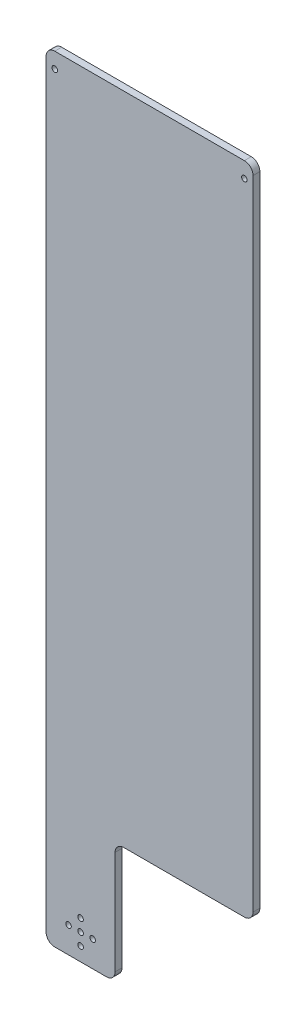
ISO-10303-21;
HEADER;
FILE_DESCRIPTION(('STEP AP214'),'2;1');
FILE_NAME('part.step','',(''),(''),'','','');
FILE_SCHEMA(('AUTOMOTIVE_DESIGN { 1 0 10303 214 1 1 1 1 }'));
ENDSEC;
DATA;
#1=APPLICATION_CONTEXT('core data for automotive mechanical design processes');
#2=APPLICATION_PROTOCOL_DEFINITION('international standard','automotive_design',2000,#1);
#3=PRODUCT_CONTEXT('',#1,'mechanical');
#4=PRODUCT('Part','Part','',(#3));
#5=PRODUCT_RELATED_PRODUCT_CATEGORY('part','',(#4));
#6=PRODUCT_DEFINITION_FORMATION('','',#4);
#7=PRODUCT_DEFINITION_CONTEXT('part definition',#1,'design');
#8=PRODUCT_DEFINITION('design','',#6,#7);
#9=PRODUCT_DEFINITION_SHAPE('','',#8);
#10=(LENGTH_UNIT() NAMED_UNIT(*) SI_UNIT(.MILLI.,.METRE.));
#11=(NAMED_UNIT(*) PLANE_ANGLE_UNIT() SI_UNIT($,.RADIAN.));
#12=(NAMED_UNIT(*) SI_UNIT($,.STERADIAN.) SOLID_ANGLE_UNIT());
#13=UNCERTAINTY_MEASURE_WITH_UNIT(LENGTH_MEASURE(1.E-05),#10,'distance_accuracy_value','');
#14=(GEOMETRIC_REPRESENTATION_CONTEXT(3) GLOBAL_UNCERTAINTY_ASSIGNED_CONTEXT((#13)) GLOBAL_UNIT_ASSIGNED_CONTEXT((#10,
#11,#12)) REPRESENTATION_CONTEXT('',''));
#15=CARTESIAN_POINT('',(0.,0.,0.));
#16=DIRECTION('',(0.,0.,1.));
#17=DIRECTION('',(1.,0.,0.));
#18=AXIS2_PLACEMENT_3D('',#15,#16,#17);
#19=CARTESIAN_POINT('',(0.,0.,4.));
#20=DIRECTION('',(0.,0.,-1.));
#21=DIRECTION('',(-1.,0.,0.));
#22=AXIS2_PLACEMENT_3D('',#19,#20,#21);
#23=PLANE('',#22);
#24=DIRECTION('',(1.,0.,0.));
#25=VECTOR('',#24,1.);
#26=CARTESIAN_POINT('',(120.,70.,4.));
#27=LINE('',#26,#25);
#28=CARTESIAN_POINT('',(45.,70.,4.));
#29=VERTEX_POINT('',#28);
#30=CARTESIAN_POINT('',(115.,70.,4.));
#31=VERTEX_POINT('',#30);
#32=EDGE_CURVE('E216',#29,#31,#27,.T.);
#33=ORIENTED_EDGE('',*,*,#32,.T.);
#34=CARTESIAN_POINT('',(115.,75.,4.));
#35=DIRECTION('',(0.,0.,-1.));
#36=DIRECTION('',(-1.,0.,0.));
#37=AXIS2_PLACEMENT_3D('',#34,#35,#36);
#38=CIRCLE('',#37,5.);
#39=CARTESIAN_POINT('',(120.,75.,4.));
#40=VERTEX_POINT('',#39);
#41=EDGE_CURVE('E180',#31,#40,#38,.F.);
#42=ORIENTED_EDGE('',*,*,#41,.T.);
#43=DIRECTION('',(0.,1.,0.));
#44=VECTOR('',#43,1.);
#45=CARTESIAN_POINT('',(120.,450.,4.));
#46=LINE('',#45,#44);
#47=CARTESIAN_POINT('',(120.,445.,4.));
#48=VERTEX_POINT('',#47);
#49=EDGE_CURVE('E146',#40,#48,#46,.T.);
#50=ORIENTED_EDGE('',*,*,#49,.T.);
#51=CARTESIAN_POINT('',(115.,445.,4.));
#52=DIRECTION('',(0.,0.,-1.));
#53=DIRECTION('',(-1.,0.,0.));
#54=AXIS2_PLACEMENT_3D('',#51,#52,#53);
#55=CIRCLE('',#54,5.);
#56=CARTESIAN_POINT('',(115.,450.,4.));
#57=VERTEX_POINT('',#56);
#58=EDGE_CURVE('E59',#48,#57,#55,.F.);
#59=ORIENTED_EDGE('',*,*,#58,.T.);
#60=DIRECTION('',(-1.,0.,0.));
#61=VECTOR('',#60,1.);
#62=CARTESIAN_POINT('',(39.9999999999999,450.,4.));
#63=LINE('',#62,#61);
#64=CARTESIAN_POINT('',(5.,450.,4.));
#65=VERTEX_POINT('',#64);
#66=EDGE_CURVE('E163',#57,#65,#63,.T.);
#67=ORIENTED_EDGE('',*,*,#66,.T.);
#68=CARTESIAN_POINT('',(5.,445.,4.));
#69=DIRECTION('',(0.,0.,-1.));
#70=DIRECTION('',(-1.,0.,0.));
#71=AXIS2_PLACEMENT_3D('',#68,#69,#70);
#72=CIRCLE('',#71,5.);
#73=CARTESIAN_POINT('',(0.,445.,4.));
#74=VERTEX_POINT('',#73);
#75=EDGE_CURVE('E173',#65,#74,#72,.F.);
#76=ORIENTED_EDGE('',*,*,#75,.T.);
#77=DIRECTION('',(0.,-1.,0.));
#78=VECTOR('',#77,1.);
#79=CARTESIAN_POINT('',(0.,0.,4.));
#80=LINE('',#79,#78);
#81=CARTESIAN_POINT('',(0.,5.,4.));
#82=VERTEX_POINT('',#81);
#83=EDGE_CURVE('E157',#74,#82,#80,.T.);
#84=ORIENTED_EDGE('',*,*,#83,.T.);
#85=CARTESIAN_POINT('',(5.,5.,4.));
#86=DIRECTION('',(0.,0.,-1.));
#87=DIRECTION('',(-1.,0.,0.));
#88=AXIS2_PLACEMENT_3D('',#85,#86,#87);
#89=CIRCLE('',#88,5.);
#90=CARTESIAN_POINT('',(5.,0.,4.));
#91=VERTEX_POINT('',#90);
#92=EDGE_CURVE('E176',#82,#91,#89,.F.);
#93=ORIENTED_EDGE('',*,*,#92,.T.);
#94=DIRECTION('',(1.,0.,0.));
#95=VECTOR('',#94,1.);
#96=CARTESIAN_POINT('',(0.,0.,4.));
#97=LINE('',#96,#95);
#98=CARTESIAN_POINT('',(35.,0.,4.));
#99=VERTEX_POINT('',#98);
#100=EDGE_CURVE('E222',#91,#99,#97,.T.);
#101=ORIENTED_EDGE('',*,*,#100,.T.);
#102=CARTESIAN_POINT('',(35.,5.,4.));
#103=DIRECTION('',(0.,0.,-1.));
#104=DIRECTION('',(-1.,0.,0.));
#105=AXIS2_PLACEMENT_3D('',#102,#103,#104);
#106=CIRCLE('',#105,5.);
#107=CARTESIAN_POINT('',(40.,5.,4.));
#108=VERTEX_POINT('',#107);
#109=EDGE_CURVE('E178',#99,#108,#106,.F.);
#110=ORIENTED_EDGE('',*,*,#109,.T.);
#111=DIRECTION('',(0.,1.,0.));
#112=VECTOR('',#111,1.);
#113=CARTESIAN_POINT('',(40.,0.,4.));
#114=LINE('',#113,#112);
#115=CARTESIAN_POINT('',(40.,65.,4.));
#116=VERTEX_POINT('',#115);
#117=EDGE_CURVE('E217',#108,#116,#114,.T.);
#118=ORIENTED_EDGE('',*,*,#117,.T.);
#119=CARTESIAN_POINT('',(45.,65.,4.));
#120=DIRECTION('',(0.,0.,-1.));
#121=DIRECTION('',(-1.,0.,0.));
#122=AXIS2_PLACEMENT_3D('',#119,#120,#121);
#123=CIRCLE('',#122,5.);
#124=EDGE_CURVE('E11',#116,#29,#123,.T.);
#125=ORIENTED_EDGE('',*,*,#124,.T.);
#126=EDGE_LOOP('',(#33,#42,#50,#59,#67,#76,#84,#93,#101,#110,#118,#125));
#127=FACE_BOUND('',#126,.T.);
#128=CARTESIAN_POINT('',(20.,8.,4.));
#129=DIRECTION('',(0.,0.,1.));
#130=DIRECTION('',(1.,0.,0.));
#131=AXIS2_PLACEMENT_3D('',#128,#129,#130);
#132=CIRCLE('',#131,1.6);
#133=CARTESIAN_POINT('',(21.6,8.,4.));
#134=VERTEX_POINT('',#133);
#135=EDGE_CURVE('E230',#134,#134,#132,.T.);
#136=ORIENTED_EDGE('',*,*,#135,.F.);
#137=EDGE_LOOP('',(#136));
#138=FACE_BOUND('',#137,.T.);
#139=CARTESIAN_POINT('',(20.,22.,4.));
#140=DIRECTION('',(0.,0.,1.));
#141=DIRECTION('',(1.,0.,0.));
#142=AXIS2_PLACEMENT_3D('',#139,#140,#141);
#143=CIRCLE('',#142,1.6);
#144=CARTESIAN_POINT('',(21.6,22.,4.));
#145=VERTEX_POINT('',#144);
#146=EDGE_CURVE('E249',#145,#145,#143,.T.);
#147=ORIENTED_EDGE('',*,*,#146,.F.);
#148=EDGE_LOOP('',(#147));
#149=FACE_BOUND('',#148,.T.);
#150=CARTESIAN_POINT('',(27.,15.,4.));
#151=DIRECTION('',(0.,0.,1.));
#152=DIRECTION('',(1.,0.,0.));
#153=AXIS2_PLACEMENT_3D('',#150,#151,#152);
#154=CIRCLE('',#153,1.6);
#155=CARTESIAN_POINT('',(28.6,15.,4.));
#156=VERTEX_POINT('',#155);
#157=EDGE_CURVE('E255',#156,#156,#154,.T.);
#158=ORIENTED_EDGE('',*,*,#157,.F.);
#159=EDGE_LOOP('',(#158));
#160=FACE_BOUND('',#159,.T.);
#161=CARTESIAN_POINT('',(13.,15.,4.));
#162=DIRECTION('',(0.,0.,1.));
#163=DIRECTION('',(1.,0.,0.));
#164=AXIS2_PLACEMENT_3D('',#161,#162,#163);
#165=CIRCLE('',#164,1.6);
#166=CARTESIAN_POINT('',(14.6,15.,4.));
#167=VERTEX_POINT('',#166);
#168=EDGE_CURVE('E261',#167,#167,#165,.T.);
#169=ORIENTED_EDGE('',*,*,#168,.F.);
#170=EDGE_LOOP('',(#169));
#171=FACE_BOUND('',#170,.T.);
#172=CARTESIAN_POINT('',(20.,15.,4.));
#173=DIRECTION('',(0.,0.,1.));
#174=DIRECTION('',(1.,0.,0.));
#175=AXIS2_PLACEMENT_3D('',#172,#173,#174);
#176=CIRCLE('',#175,1.6);
#177=CARTESIAN_POINT('',(21.6,15.,4.));
#178=VERTEX_POINT('',#177);
#179=EDGE_CURVE('E267',#178,#178,#176,.T.);
#180=ORIENTED_EDGE('',*,*,#179,.F.);
#181=EDGE_LOOP('',(#180));
#182=FACE_BOUND('',#181,.T.);
#183=CARTESIAN_POINT('',(115.,441.,4.));
#184=DIRECTION('',(0.,0.,1.));
#185=DIRECTION('',(1.,0.,0.));
#186=AXIS2_PLACEMENT_3D('',#183,#184,#185);
#187=CIRCLE('',#186,1.59999999999999);
#188=CARTESIAN_POINT('',(116.6,441.,4.));
#189=VERTEX_POINT('',#188);
#190=EDGE_CURVE('E273',#189,#189,#187,.T.);
#191=ORIENTED_EDGE('',*,*,#190,.F.);
#192=EDGE_LOOP('',(#191));
#193=FACE_BOUND('',#192,.T.);
#194=CARTESIAN_POINT('',(5.,441.,4.));
#195=DIRECTION('',(0.,0.,1.));
#196=DIRECTION('',(1.,0.,0.));
#197=AXIS2_PLACEMENT_3D('',#194,#195,#196);
#198=CIRCLE('',#197,1.59999999999998);
#199=CARTESIAN_POINT('',(6.59999999999998,441.,4.));
#200=VERTEX_POINT('',#199);
#201=EDGE_CURVE('E279',#200,#200,#198,.T.);
#202=ORIENTED_EDGE('',*,*,#201,.F.);
#203=EDGE_LOOP('',(#202));
#204=FACE_BOUND('',#203,.T.);
#205=ADVANCED_FACE('F37',(#127,#138,#149,#160,#171,#182,#193,#204),#23,.F.);
#206=CARTESIAN_POINT('',(0.,0.,0.));
#207=DIRECTION('',(0.,0.,-1.));
#208=DIRECTION('',(-1.,0.,0.));
#209=AXIS2_PLACEMENT_3D('',#206,#207,#208);
#210=PLANE('',#209);
#211=CARTESIAN_POINT('',(115.,441.,0.));
#212=DIRECTION('',(0.,0.,1.));
#213=DIRECTION('',(1.,0.,0.));
#214=AXIS2_PLACEMENT_3D('',#211,#212,#213);
#215=CIRCLE('',#214,1.59999999999999);
#216=CARTESIAN_POINT('',(116.6,441.,0.));
#217=VERTEX_POINT('',#216);
#218=EDGE_CURVE('E276',#217,#217,#215,.T.);
#219=ORIENTED_EDGE('',*,*,#218,.T.);
#220=EDGE_LOOP('',(#219));
#221=FACE_BOUND('',#220,.T.);
#222=CARTESIAN_POINT('',(13.,15.,0.));
#223=DIRECTION('',(0.,0.,1.));
#224=DIRECTION('',(1.,0.,0.));
#225=AXIS2_PLACEMENT_3D('',#222,#223,#224);
#226=CIRCLE('',#225,1.6);
#227=CARTESIAN_POINT('',(14.6,15.,0.));
#228=VERTEX_POINT('',#227);
#229=EDGE_CURVE('E264',#228,#228,#226,.T.);
#230=ORIENTED_EDGE('',*,*,#229,.T.);
#231=EDGE_LOOP('',(#230));
#232=FACE_BOUND('',#231,.T.);
#233=CARTESIAN_POINT('',(20.,22.,0.));
#234=DIRECTION('',(0.,0.,1.));
#235=DIRECTION('',(1.,0.,0.));
#236=AXIS2_PLACEMENT_3D('',#233,#234,#235);
#237=CIRCLE('',#236,1.6);
#238=CARTESIAN_POINT('',(21.6,22.,0.));
#239=VERTEX_POINT('',#238);
#240=EDGE_CURVE('E252',#239,#239,#237,.T.);
#241=ORIENTED_EDGE('',*,*,#240,.T.);
#242=EDGE_LOOP('',(#241));
#243=FACE_BOUND('',#242,.T.);
#244=DIRECTION('',(0.,1.,0.));
#245=VECTOR('',#244,1.);
#246=CARTESIAN_POINT('',(120.,450.,0.));
#247=LINE('',#246,#245);
#248=CARTESIAN_POINT('',(120.,75.,0.));
#249=VERTEX_POINT('',#248);
#250=CARTESIAN_POINT('',(120.,445.,0.));
#251=VERTEX_POINT('',#250);
#252=EDGE_CURVE('E144',#249,#251,#247,.T.);
#253=ORIENTED_EDGE('',*,*,#252,.F.);
#254=CARTESIAN_POINT('',(115.,75.,0.));
#255=DIRECTION('',(0.,0.,-1.));
#256=DIRECTION('',(-1.,0.,0.));
#257=AXIS2_PLACEMENT_3D('',#254,#255,#256);
#258=CIRCLE('',#257,5.);
#259=CARTESIAN_POINT('',(115.,70.,0.));
#260=VERTEX_POINT('',#259);
#261=EDGE_CURVE('E127',#249,#260,#258,.T.);
#262=ORIENTED_EDGE('',*,*,#261,.T.);
#263=DIRECTION('',(1.,0.,0.));
#264=VECTOR('',#263,1.);
#265=CARTESIAN_POINT('',(120.,70.,0.));
#266=LINE('',#265,#264);
#267=CARTESIAN_POINT('',(45.,70.,0.));
#268=VERTEX_POINT('',#267);
#269=EDGE_CURVE('E155',#268,#260,#266,.T.);
#270=ORIENTED_EDGE('',*,*,#269,.F.);
#271=CARTESIAN_POINT('',(45.,65.,0.));
#272=DIRECTION('',(0.,0.,-1.));
#273=DIRECTION('',(-1.,0.,0.));
#274=AXIS2_PLACEMENT_3D('',#271,#272,#273);
#275=CIRCLE('',#274,5.);
#276=CARTESIAN_POINT('',(40.,65.,0.));
#277=VERTEX_POINT('',#276);
#278=EDGE_CURVE('E45',#268,#277,#275,.F.);
#279=ORIENTED_EDGE('',*,*,#278,.T.);
#280=DIRECTION('',(0.,1.,0.));
#281=VECTOR('',#280,1.);
#282=CARTESIAN_POINT('',(40.,0.,0.));
#283=LINE('',#282,#281);
#284=CARTESIAN_POINT('',(40.,5.,0.));
#285=VERTEX_POINT('',#284);
#286=EDGE_CURVE('E159',#285,#277,#283,.T.);
#287=ORIENTED_EDGE('',*,*,#286,.F.);
#288=CARTESIAN_POINT('',(35.,5.,0.));
#289=DIRECTION('',(0.,0.,-1.));
#290=DIRECTION('',(-1.,0.,0.));
#291=AXIS2_PLACEMENT_3D('',#288,#289,#290);
#292=CIRCLE('',#291,5.);
#293=CARTESIAN_POINT('',(35.,0.,0.));
#294=VERTEX_POINT('',#293);
#295=EDGE_CURVE('E138',#285,#294,#292,.T.);
#296=ORIENTED_EDGE('',*,*,#295,.T.);
#297=DIRECTION('',(1.,0.,0.));
#298=VECTOR('',#297,1.);
#299=CARTESIAN_POINT('',(0.,0.,0.));
#300=LINE('',#299,#298);
#301=CARTESIAN_POINT('',(5.,0.,0.));
#302=VERTEX_POINT('',#301);
#303=EDGE_CURVE('E210',#302,#294,#300,.T.);
#304=ORIENTED_EDGE('',*,*,#303,.F.);
#305=CARTESIAN_POINT('',(5.,5.,0.));
#306=DIRECTION('',(0.,0.,-1.));
#307=DIRECTION('',(-1.,0.,0.));
#308=AXIS2_PLACEMENT_3D('',#305,#306,#307);
#309=CIRCLE('',#308,5.);
#310=CARTESIAN_POINT('',(0.,5.,0.));
#311=VERTEX_POINT('',#310);
#312=EDGE_CURVE('E167',#302,#311,#309,.T.);
#313=ORIENTED_EDGE('',*,*,#312,.T.);
#314=DIRECTION('',(0.,-1.,0.));
#315=VECTOR('',#314,1.);
#316=CARTESIAN_POINT('',(0.,0.,0.));
#317=LINE('',#316,#315);
#318=CARTESIAN_POINT('',(0.,445.,0.));
#319=VERTEX_POINT('',#318);
#320=EDGE_CURVE('E227',#319,#311,#317,.T.);
#321=ORIENTED_EDGE('',*,*,#320,.F.);
#322=CARTESIAN_POINT('',(5.,445.,0.));
#323=DIRECTION('',(0.,0.,-1.));
#324=DIRECTION('',(-1.,0.,0.));
#325=AXIS2_PLACEMENT_3D('',#322,#323,#324);
#326=CIRCLE('',#325,5.);
#327=CARTESIAN_POINT('',(5.,450.,0.));
#328=VERTEX_POINT('',#327);
#329=EDGE_CURVE('E147',#319,#328,#326,.T.);
#330=ORIENTED_EDGE('',*,*,#329,.T.);
#331=DIRECTION('',(-1.,0.,0.));
#332=VECTOR('',#331,1.);
#333=CARTESIAN_POINT('',(0.,450.,0.));
#334=LINE('',#333,#332);
#335=CARTESIAN_POINT('',(115.,450.,0.));
#336=VERTEX_POINT('',#335);
#337=EDGE_CURVE('E154',#336,#328,#334,.T.);
#338=ORIENTED_EDGE('',*,*,#337,.F.);
#339=CARTESIAN_POINT('',(115.,445.,0.));
#340=DIRECTION('',(0.,0.,-1.));
#341=DIRECTION('',(-1.,0.,0.));
#342=AXIS2_PLACEMENT_3D('',#339,#340,#341);
#343=CIRCLE('',#342,5.);
#344=EDGE_CURVE('E153',#336,#251,#343,.T.);
#345=ORIENTED_EDGE('',*,*,#344,.T.);
#346=EDGE_LOOP('',(#253,#262,#270,#279,#287,#296,#304,#313,#321,#330,#338,#345));
#347=FACE_BOUND('',#346,.T.);
#348=CARTESIAN_POINT('',(20.,8.,0.));
#349=DIRECTION('',(0.,0.,1.));
#350=DIRECTION('',(1.,0.,0.));
#351=AXIS2_PLACEMENT_3D('',#348,#349,#350);
#352=CIRCLE('',#351,1.6);
#353=CARTESIAN_POINT('',(21.6,8.,0.));
#354=VERTEX_POINT('',#353);
#355=EDGE_CURVE('E246',#354,#354,#352,.T.);
#356=ORIENTED_EDGE('',*,*,#355,.T.);
#357=EDGE_LOOP('',(#356));
#358=FACE_BOUND('',#357,.T.);
#359=CARTESIAN_POINT('',(27.,15.,0.));
#360=DIRECTION('',(0.,0.,1.));
#361=DIRECTION('',(1.,0.,0.));
#362=AXIS2_PLACEMENT_3D('',#359,#360,#361);
#363=CIRCLE('',#362,1.6);
#364=CARTESIAN_POINT('',(28.6,15.,0.));
#365=VERTEX_POINT('',#364);
#366=EDGE_CURVE('E258',#365,#365,#363,.T.);
#367=ORIENTED_EDGE('',*,*,#366,.T.);
#368=EDGE_LOOP('',(#367));
#369=FACE_BOUND('',#368,.T.);
#370=CARTESIAN_POINT('',(20.,15.,0.));
#371=DIRECTION('',(0.,0.,1.));
#372=DIRECTION('',(1.,0.,0.));
#373=AXIS2_PLACEMENT_3D('',#370,#371,#372);
#374=CIRCLE('',#373,1.6);
#375=CARTESIAN_POINT('',(21.6,15.,0.));
#376=VERTEX_POINT('',#375);
#377=EDGE_CURVE('E270',#376,#376,#374,.T.);
#378=ORIENTED_EDGE('',*,*,#377,.T.);
#379=EDGE_LOOP('',(#378));
#380=FACE_BOUND('',#379,.T.);
#381=CARTESIAN_POINT('',(5.,441.,0.));
#382=DIRECTION('',(0.,0.,1.));
#383=DIRECTION('',(1.,0.,0.));
#384=AXIS2_PLACEMENT_3D('',#381,#382,#383);
#385=CIRCLE('',#384,1.59999999999998);
#386=CARTESIAN_POINT('',(6.59999999999998,441.,0.));
#387=VERTEX_POINT('',#386);
#388=EDGE_CURVE('E282',#387,#387,#385,.T.);
#389=ORIENTED_EDGE('',*,*,#388,.T.);
#390=EDGE_LOOP('',(#389));
#391=FACE_BOUND('',#390,.T.);
#392=ADVANCED_FACE('F150',(#221,#232,#243,#347,#358,#369,#380,#391),#210,.T.);
#393=CARTESIAN_POINT('',(0.,0.,4.));
#394=DIRECTION('',(1.,0.,0.));
#395=DIRECTION('',(0.,0.,-1.));
#396=AXIS2_PLACEMENT_3D('',#393,#394,#395);
#397=PLANE('',#396);
#398=ORIENTED_EDGE('',*,*,#320,.T.);
#399=DIRECTION('',(0.,0.,-1.));
#400=VECTOR('',#399,1.);
#401=CARTESIAN_POINT('',(0.,5.,4.));
#402=LINE('',#401,#400);
#403=EDGE_CURVE('E195',#311,#82,#402,.F.);
#404=ORIENTED_EDGE('',*,*,#403,.T.);
#405=ORIENTED_EDGE('',*,*,#83,.F.);
#406=DIRECTION('',(0.,0.,-1.));
#407=VECTOR('',#406,1.);
#408=CARTESIAN_POINT('',(0.,445.,4.));
#409=LINE('',#408,#407);
#410=EDGE_CURVE('E192',#74,#319,#409,.T.);
#411=ORIENTED_EDGE('',*,*,#410,.T.);
#412=EDGE_LOOP('',(#398,#404,#405,#411));
#413=FACE_BOUND('',#412,.T.);
#414=ADVANCED_FACE('F296',(#413),#397,.F.);
#415=CARTESIAN_POINT('',(0.,0.,4.));
#416=DIRECTION('',(0.,1.,0.));
#417=DIRECTION('',(0.,0.,1.));
#418=AXIS2_PLACEMENT_3D('',#415,#416,#417);
#419=PLANE('',#418);
#420=ORIENTED_EDGE('',*,*,#303,.T.);
#421=DIRECTION('',(0.,0.,-1.));
#422=VECTOR('',#421,1.);
#423=CARTESIAN_POINT('',(35.,0.,4.));
#424=LINE('',#423,#422);
#425=EDGE_CURVE('E190',#294,#99,#424,.F.);
#426=ORIENTED_EDGE('',*,*,#425,.T.);
#427=ORIENTED_EDGE('',*,*,#100,.F.);
#428=DIRECTION('',(0.,0.,-1.));
#429=VECTOR('',#428,1.);
#430=CARTESIAN_POINT('',(5.,0.,4.));
#431=LINE('',#430,#429);
#432=EDGE_CURVE('E187',#91,#302,#431,.T.);
#433=ORIENTED_EDGE('',*,*,#432,.T.);
#434=EDGE_LOOP('',(#420,#426,#427,#433));
#435=FACE_BOUND('',#434,.T.);
#436=ADVANCED_FACE('F235',(#435),#419,.F.);
#437=CARTESIAN_POINT('',(40.,0.,4.));
#438=DIRECTION('',(-1.,0.,0.));
#439=DIRECTION('',(0.,-1.,0.));
#440=AXIS2_PLACEMENT_3D('',#437,#438,#439);
#441=PLANE('',#440);
#442=ORIENTED_EDGE('',*,*,#286,.T.);
#443=DIRECTION('',(0.,0.,-1.));
#444=VECTOR('',#443,1.);
#445=CARTESIAN_POINT('',(40.,65.,4.));
#446=LINE('',#445,#444);
#447=EDGE_CURVE('E185',#277,#116,#446,.F.);
#448=ORIENTED_EDGE('',*,*,#447,.T.);
#449=ORIENTED_EDGE('',*,*,#117,.F.);
#450=DIRECTION('',(0.,0.,-1.));
#451=VECTOR('',#450,1.);
#452=CARTESIAN_POINT('',(40.,5.,4.));
#453=LINE('',#452,#451);
#454=EDGE_CURVE('E182',#108,#285,#453,.T.);
#455=ORIENTED_EDGE('',*,*,#454,.T.);
#456=EDGE_LOOP('',(#442,#448,#449,#455));
#457=FACE_BOUND('',#456,.T.);
#458=ADVANCED_FACE('F206',(#457),#441,.F.);
#459=CARTESIAN_POINT('',(120.,70.,4.));
#460=DIRECTION('',(0.,1.,0.));
#461=DIRECTION('',(-1.,0.,0.));
#462=AXIS2_PLACEMENT_3D('',#459,#460,#461);
#463=PLANE('',#462);
#464=ORIENTED_EDGE('',*,*,#269,.T.);
#465=DIRECTION('',(0.,0.,-1.));
#466=VECTOR('',#465,1.);
#467=CARTESIAN_POINT('',(115.,70.,4.));
#468=LINE('',#467,#466);
#469=EDGE_CURVE('E132',#260,#31,#468,.F.);
#470=ORIENTED_EDGE('',*,*,#469,.T.);
#471=ORIENTED_EDGE('',*,*,#32,.F.);
#472=DIRECTION('',(0.,0.,-1.));
#473=VECTOR('',#472,1.);
#474=CARTESIAN_POINT('',(45.,70.,0.));
#475=LINE('',#474,#473);
#476=EDGE_CURVE('E137',#29,#268,#475,.T.);
#477=ORIENTED_EDGE('',*,*,#476,.T.);
#478=EDGE_LOOP('',(#464,#470,#471,#477));
#479=FACE_BOUND('',#478,.T.);
#480=ADVANCED_FACE('F219',(#479),#463,.F.);
#481=CARTESIAN_POINT('',(120.,450.,4.));
#482=DIRECTION('',(-1.,0.,0.));
#483=DIRECTION('',(0.,-1.,0.));
#484=AXIS2_PLACEMENT_3D('',#481,#482,#483);
#485=PLANE('',#484);
#486=ORIENTED_EDGE('',*,*,#49,.F.);
#487=DIRECTION('',(0.,0.,-1.));
#488=VECTOR('',#487,1.);
#489=CARTESIAN_POINT('',(120.,75.,4.));
#490=LINE('',#489,#488);
#491=EDGE_CURVE('E131',#40,#249,#490,.T.);
#492=ORIENTED_EDGE('',*,*,#491,.T.);
#493=ORIENTED_EDGE('',*,*,#252,.T.);
#494=DIRECTION('',(0.,0.,-1.));
#495=VECTOR('',#494,1.);
#496=CARTESIAN_POINT('',(120.,445.,4.));
#497=LINE('',#496,#495);
#498=EDGE_CURVE('E148',#251,#48,#497,.F.);
#499=ORIENTED_EDGE('',*,*,#498,.T.);
#500=EDGE_LOOP('',(#486,#492,#493,#499));
#501=FACE_BOUND('',#500,.T.);
#502=ADVANCED_FACE('F143',(#501),#485,.F.);
#503=CARTESIAN_POINT('',(0.,450.,4.));
#504=DIRECTION('',(0.,-1.,0.));
#505=DIRECTION('',(0.,0.,-1.));
#506=AXIS2_PLACEMENT_3D('',#503,#504,#505);
#507=PLANE('',#506);
#508=ORIENTED_EDGE('',*,*,#66,.F.);
#509=DIRECTION('',(0.,0.,-1.));
#510=VECTOR('',#509,1.);
#511=CARTESIAN_POINT('',(115.,450.,4.));
#512=LINE('',#511,#510);
#513=EDGE_CURVE('E198',#57,#336,#512,.T.);
#514=ORIENTED_EDGE('',*,*,#513,.T.);
#515=ORIENTED_EDGE('',*,*,#337,.T.);
#516=DIRECTION('',(0.,0.,-1.));
#517=VECTOR('',#516,1.);
#518=CARTESIAN_POINT('',(5.,450.,4.));
#519=LINE('',#518,#517);
#520=EDGE_CURVE('E52',#328,#65,#519,.F.);
#521=ORIENTED_EDGE('',*,*,#520,.T.);
#522=EDGE_LOOP('',(#508,#514,#515,#521));
#523=FACE_BOUND('',#522,.T.);
#524=ADVANCED_FACE('F303',(#523),#507,.F.);
#525=CARTESIAN_POINT('',(20.,8.,4.));
#526=DIRECTION('',(0.,0.,-1.));
#527=DIRECTION('',(-1.,0.,0.));
#528=AXIS2_PLACEMENT_3D('',#525,#526,#527);
#529=CYLINDRICAL_SURFACE('',#528,1.6);
#530=ORIENTED_EDGE('',*,*,#135,.T.);
#531=EDGE_LOOP('',(#530));
#532=FACE_BOUND('',#531,.T.);
#533=ORIENTED_EDGE('',*,*,#355,.F.);
#534=EDGE_LOOP('',(#533));
#535=FACE_BOUND('',#534,.T.);
#536=ADVANCED_FACE('F300',(#532,#535),#529,.F.);
#537=CARTESIAN_POINT('',(20.,22.,4.));
#538=DIRECTION('',(0.,0.,-1.));
#539=DIRECTION('',(-1.,0.,0.));
#540=AXIS2_PLACEMENT_3D('',#537,#538,#539);
#541=CYLINDRICAL_SURFACE('',#540,1.6);
#542=ORIENTED_EDGE('',*,*,#146,.T.);
#543=EDGE_LOOP('',(#542));
#544=FACE_BOUND('',#543,.T.);
#545=ORIENTED_EDGE('',*,*,#240,.F.);
#546=EDGE_LOOP('',(#545));
#547=FACE_BOUND('',#546,.T.);
#548=ADVANCED_FACE('F466',(#544,#547),#541,.F.);
#549=CARTESIAN_POINT('',(27.,15.,4.));
#550=DIRECTION('',(0.,0.,-1.));
#551=DIRECTION('',(-1.,0.,0.));
#552=AXIS2_PLACEMENT_3D('',#549,#550,#551);
#553=CYLINDRICAL_SURFACE('',#552,1.6);
#554=ORIENTED_EDGE('',*,*,#157,.T.);
#555=EDGE_LOOP('',(#554));
#556=FACE_BOUND('',#555,.T.);
#557=ORIENTED_EDGE('',*,*,#366,.F.);
#558=EDGE_LOOP('',(#557));
#559=FACE_BOUND('',#558,.T.);
#560=ADVANCED_FACE('F456',(#556,#559),#553,.F.);
#561=CARTESIAN_POINT('',(13.,15.,4.));
#562=DIRECTION('',(0.,0.,-1.));
#563=DIRECTION('',(-1.,0.,0.));
#564=AXIS2_PLACEMENT_3D('',#561,#562,#563);
#565=CYLINDRICAL_SURFACE('',#564,1.6);
#566=ORIENTED_EDGE('',*,*,#168,.T.);
#567=EDGE_LOOP('',(#566));
#568=FACE_BOUND('',#567,.T.);
#569=ORIENTED_EDGE('',*,*,#229,.F.);
#570=EDGE_LOOP('',(#569));
#571=FACE_BOUND('',#570,.T.);
#572=ADVANCED_FACE('F446',(#568,#571),#565,.F.);
#573=CARTESIAN_POINT('',(20.,15.,4.));
#574=DIRECTION('',(0.,0.,-1.));
#575=DIRECTION('',(-1.,0.,0.));
#576=AXIS2_PLACEMENT_3D('',#573,#574,#575);
#577=CYLINDRICAL_SURFACE('',#576,1.6);
#578=ORIENTED_EDGE('',*,*,#179,.T.);
#579=EDGE_LOOP('',(#578));
#580=FACE_BOUND('',#579,.T.);
#581=ORIENTED_EDGE('',*,*,#377,.F.);
#582=EDGE_LOOP('',(#581));
#583=FACE_BOUND('',#582,.T.);
#584=ADVANCED_FACE('F436',(#580,#583),#577,.F.);
#585=CARTESIAN_POINT('',(115.,441.,4.));
#586=DIRECTION('',(0.,0.,-1.));
#587=DIRECTION('',(-1.,0.,0.));
#588=AXIS2_PLACEMENT_3D('',#585,#586,#587);
#589=CYLINDRICAL_SURFACE('',#588,1.59999999999999);
#590=ORIENTED_EDGE('',*,*,#190,.T.);
#591=EDGE_LOOP('',(#590));
#592=FACE_BOUND('',#591,.T.);
#593=ORIENTED_EDGE('',*,*,#218,.F.);
#594=EDGE_LOOP('',(#593));
#595=FACE_BOUND('',#594,.T.);
#596=ADVANCED_FACE('F427',(#592,#595),#589,.F.);
#597=CARTESIAN_POINT('',(5.,441.,4.));
#598=DIRECTION('',(0.,0.,-1.));
#599=DIRECTION('',(-1.,0.,0.));
#600=AXIS2_PLACEMENT_3D('',#597,#598,#599);
#601=CYLINDRICAL_SURFACE('',#600,1.59999999999998);
#602=ORIENTED_EDGE('',*,*,#201,.T.);
#603=EDGE_LOOP('',(#602));
#604=FACE_BOUND('',#603,.T.);
#605=ORIENTED_EDGE('',*,*,#388,.F.);
#606=EDGE_LOOP('',(#605));
#607=FACE_BOUND('',#606,.T.);
#608=ADVANCED_FACE('F288',(#604,#607),#601,.F.);
#609=CARTESIAN_POINT('',(115.,75.,4.));
#610=DIRECTION('',(0.,0.,-1.));
#611=DIRECTION('',(-1.,0.,0.));
#612=AXIS2_PLACEMENT_3D('',#609,#610,#611);
#613=CYLINDRICAL_SURFACE('',#612,5.);
#614=ORIENTED_EDGE('',*,*,#41,.F.);
#615=ORIENTED_EDGE('',*,*,#469,.F.);
#616=ORIENTED_EDGE('',*,*,#261,.F.);
#617=ORIENTED_EDGE('',*,*,#491,.F.);
#618=EDGE_LOOP('',(#614,#615,#616,#617));
#619=FACE_BOUND('',#618,.T.);
#620=ADVANCED_FACE('F130',(#619),#613,.T.);
#621=CARTESIAN_POINT('',(45.,65.,4.));
#622=DIRECTION('',(0.,0.,1.));
#623=DIRECTION('',(1.,0.,0.));
#624=AXIS2_PLACEMENT_3D('',#621,#622,#623);
#625=CYLINDRICAL_SURFACE('',#624,5.);
#626=ORIENTED_EDGE('',*,*,#124,.F.);
#627=ORIENTED_EDGE('',*,*,#447,.F.);
#628=ORIENTED_EDGE('',*,*,#278,.F.);
#629=ORIENTED_EDGE('',*,*,#476,.F.);
#630=EDGE_LOOP('',(#626,#627,#628,#629));
#631=FACE_BOUND('',#630,.T.);
#632=ADVANCED_FACE('F212',(#631),#625,.F.);
#633=CARTESIAN_POINT('',(35.,5.,4.));
#634=DIRECTION('',(0.,0.,-1.));
#635=DIRECTION('',(-1.,0.,0.));
#636=AXIS2_PLACEMENT_3D('',#633,#634,#635);
#637=CYLINDRICAL_SURFACE('',#636,5.);
#638=ORIENTED_EDGE('',*,*,#109,.F.);
#639=ORIENTED_EDGE('',*,*,#425,.F.);
#640=ORIENTED_EDGE('',*,*,#295,.F.);
#641=ORIENTED_EDGE('',*,*,#454,.F.);
#642=EDGE_LOOP('',(#638,#639,#640,#641));
#643=FACE_BOUND('',#642,.T.);
#644=ADVANCED_FACE('F241',(#643),#637,.T.);
#645=CARTESIAN_POINT('',(5.,5.,4.));
#646=DIRECTION('',(0.,0.,-1.));
#647=DIRECTION('',(-1.,0.,0.));
#648=AXIS2_PLACEMENT_3D('',#645,#646,#647);
#649=CYLINDRICAL_SURFACE('',#648,5.);
#650=ORIENTED_EDGE('',*,*,#92,.F.);
#651=ORIENTED_EDGE('',*,*,#403,.F.);
#652=ORIENTED_EDGE('',*,*,#312,.F.);
#653=ORIENTED_EDGE('',*,*,#432,.F.);
#654=EDGE_LOOP('',(#650,#651,#652,#653));
#655=FACE_BOUND('',#654,.T.);
#656=ADVANCED_FACE('F323',(#655),#649,.T.);
#657=CARTESIAN_POINT('',(115.,445.,4.));
#658=DIRECTION('',(0.,0.,-1.));
#659=DIRECTION('',(-1.,0.,0.));
#660=AXIS2_PLACEMENT_3D('',#657,#658,#659);
#661=CYLINDRICAL_SURFACE('',#660,5.);
#662=ORIENTED_EDGE('',*,*,#58,.F.);
#663=ORIENTED_EDGE('',*,*,#498,.F.);
#664=ORIENTED_EDGE('',*,*,#344,.F.);
#665=ORIENTED_EDGE('',*,*,#513,.F.);
#666=EDGE_LOOP('',(#662,#663,#664,#665));
#667=FACE_BOUND('',#666,.T.);
#668=ADVANCED_FACE('F325',(#667),#661,.T.);
#669=CARTESIAN_POINT('',(5.,445.,4.));
#670=DIRECTION('',(0.,0.,-1.));
#671=DIRECTION('',(-1.,0.,0.));
#672=AXIS2_PLACEMENT_3D('',#669,#670,#671);
#673=CYLINDRICAL_SURFACE('',#672,5.);
#674=ORIENTED_EDGE('',*,*,#75,.F.);
#675=ORIENTED_EDGE('',*,*,#520,.F.);
#676=ORIENTED_EDGE('',*,*,#329,.F.);
#677=ORIENTED_EDGE('',*,*,#410,.F.);
#678=EDGE_LOOP('',(#674,#675,#676,#677));
#679=FACE_BOUND('',#678,.T.);
#680=ADVANCED_FACE('F39',(#679),#673,.T.);
#681=CLOSED_SHELL('',(#205,#392,#414,#436,#458,#480,#502,#524,#536,#548,#560,#572,#584,#596,
#608,#620,#632,#644,#656,#668,#680));
#682=MANIFOLD_SOLID_BREP('B2',#681);
#683=ADVANCED_BREP_SHAPE_REPRESENTATION('',(#18,#682),#14);
#684=SHAPE_DEFINITION_REPRESENTATION(#9,#683);
ENDSEC;
END-ISO-10303-21;
